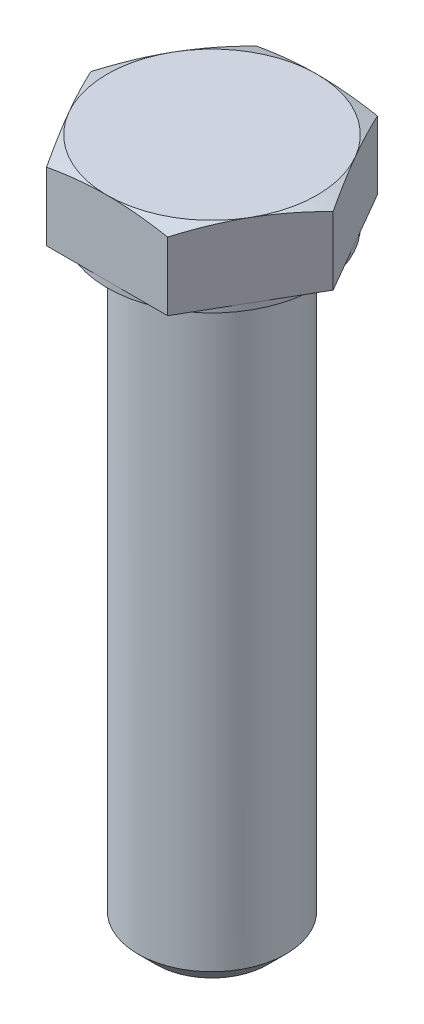
ISO-10303-21;
HEADER;
FILE_DESCRIPTION(('STEP AP214'),'2;1');
FILE_NAME('part.step','',(''),(''),'','','');
FILE_SCHEMA(('AUTOMOTIVE_DESIGN { 1 0 10303 214 1 1 1 1 }'));
ENDSEC;
DATA;
#1=APPLICATION_CONTEXT('core data for automotive mechanical design processes');
#2=APPLICATION_PROTOCOL_DEFINITION('international standard','automotive_design',2000,#1);
#3=PRODUCT_CONTEXT('',#1,'mechanical');
#4=PRODUCT('Part','Part','',(#3));
#5=PRODUCT_RELATED_PRODUCT_CATEGORY('part','',(#4));
#6=PRODUCT_DEFINITION_FORMATION('','',#4);
#7=PRODUCT_DEFINITION_CONTEXT('part definition',#1,'design');
#8=PRODUCT_DEFINITION('design','',#6,#7);
#9=PRODUCT_DEFINITION_SHAPE('','',#8);
#10=(LENGTH_UNIT() NAMED_UNIT(*) SI_UNIT(.MILLI.,.METRE.));
#11=(NAMED_UNIT(*) PLANE_ANGLE_UNIT() SI_UNIT($,.RADIAN.));
#12=(NAMED_UNIT(*) SI_UNIT($,.STERADIAN.) SOLID_ANGLE_UNIT());
#13=UNCERTAINTY_MEASURE_WITH_UNIT(LENGTH_MEASURE(1.E-05),#10,'distance_accuracy_value','');
#14=(GEOMETRIC_REPRESENTATION_CONTEXT(3) GLOBAL_UNCERTAINTY_ASSIGNED_CONTEXT((#13)) GLOBAL_UNIT_ASSIGNED_CONTEXT((#10,
#11,#12)) REPRESENTATION_CONTEXT('',''));
#15=CARTESIAN_POINT('',(0.,0.,0.));
#16=DIRECTION('',(0.,0.,1.));
#17=DIRECTION('',(1.,0.,0.));
#18=AXIS2_PLACEMENT_3D('',#15,#16,#17);
#19=CARTESIAN_POINT('',(0.,100.,0.));
#20=DIRECTION('',(0.,1.,0.));
#21=DIRECTION('',(0.,0.,1.));
#22=AXIS2_PLACEMENT_3D('',#19,#20,#21);
#23=PLANE('',#22);
#24=CARTESIAN_POINT('',(0.,100.,0.));
#25=DIRECTION('',(0.,1.,0.));
#26=DIRECTION('',(0.,0.,1.));
#27=AXIS2_PLACEMENT_3D('',#24,#25,#26);
#28=CIRCLE('',#27,17.);
#29=CARTESIAN_POINT('',(-14.7224318643355,100.,8.50000000000001));
#30=VERTEX_POINT('',#29);
#31=CARTESIAN_POINT('',(-14.7224318643355,100.,-8.49999999999999));
#32=VERTEX_POINT('',#31);
#33=EDGE_CURVE('E276',#30,#32,#28,.F.);
#34=ORIENTED_EDGE('',*,*,#33,.F.);
#35=DIRECTION('',(0.5,0.,0.866025403784438));
#36=VECTOR('',#35,1.);
#37=CARTESIAN_POINT('',(-19.6299091524473,100.,0.));
#38=LINE('',#37,#36);
#39=CARTESIAN_POINT('',(-19.6299091524473,100.,0.));
#40=VERTEX_POINT('',#39);
#41=EDGE_CURVE('E301',#40,#30,#38,.T.);
#42=ORIENTED_EDGE('',*,*,#41,.F.);
#43=DIRECTION('',(-0.5,0.,0.866025403784439));
#44=VECTOR('',#43,1.);
#45=CARTESIAN_POINT('',(-9.81495457622364,100.,-17.));
#46=LINE('',#45,#44);
#47=EDGE_CURVE('E296',#32,#40,#46,.T.);
#48=ORIENTED_EDGE('',*,*,#47,.F.);
#49=EDGE_LOOP('',(#34,#42,#48));
#50=FACE_BOUND('',#49,.T.);
#51=ADVANCED_FACE('F33',(#50),#23,.F.);
#52=CARTESIAN_POINT('',(0.,100.,-17.));
#53=VERTEX_POINT('',#52);
#54=EDGE_CURVE('E324',#32,#53,#28,.F.);
#55=ORIENTED_EDGE('',*,*,#54,.F.);
#56=CARTESIAN_POINT('',(-9.81495457622364,100.,-17.));
#57=VERTEX_POINT('',#56);
#58=EDGE_CURVE('E297',#57,#32,#46,.T.);
#59=ORIENTED_EDGE('',*,*,#58,.F.);
#60=DIRECTION('',(-1.,0.,0.));
#61=VECTOR('',#60,1.);
#62=CARTESIAN_POINT('',(9.81495457622364,100.,-17.));
#63=LINE('',#62,#61);
#64=EDGE_CURVE('E292',#53,#57,#63,.T.);
#65=ORIENTED_EDGE('',*,*,#64,.F.);
#66=EDGE_LOOP('',(#55,#59,#65));
#67=FACE_BOUND('',#66,.T.);
#68=ADVANCED_FACE('F249',(#67),#23,.F.);
#69=CARTESIAN_POINT('',(14.7224318643355,100.,-8.5));
#70=VERTEX_POINT('',#69);
#71=EDGE_CURVE('E326',#53,#70,#28,.F.);
#72=ORIENTED_EDGE('',*,*,#71,.F.);
#73=CARTESIAN_POINT('',(9.81495457622364,100.,-17.));
#74=VERTEX_POINT('',#73);
#75=EDGE_CURVE('E293',#74,#53,#63,.T.);
#76=ORIENTED_EDGE('',*,*,#75,.F.);
#77=DIRECTION('',(-0.5,0.,-0.866025403784439));
#78=VECTOR('',#77,1.);
#79=CARTESIAN_POINT('',(19.6299091524473,100.,0.));
#80=LINE('',#79,#78);
#81=EDGE_CURVE('E289',#70,#74,#80,.T.);
#82=ORIENTED_EDGE('',*,*,#81,.F.);
#83=EDGE_LOOP('',(#72,#76,#82));
#84=FACE_BOUND('',#83,.T.);
#85=ADVANCED_FACE('F254',(#84),#23,.F.);
#86=CARTESIAN_POINT('',(16.318367477945,100.,-4.76559365187041));
#87=VERTEX_POINT('',#86);
#88=EDGE_CURVE('E328',#70,#87,#28,.F.);
#89=ORIENTED_EDGE('',*,*,#88,.F.);
#90=CARTESIAN_POINT('',(19.6299091524473,100.,0.));
#91=VERTEX_POINT('',#90);
#92=EDGE_CURVE('E280',#91,#70,#80,.T.);
#93=ORIENTED_EDGE('',*,*,#92,.F.);
#94=DIRECTION('',(0.5,0.,-0.866025403784439));
#95=VECTOR('',#94,1.);
#96=CARTESIAN_POINT('',(9.81495457622364,100.,17.));
#97=LINE('',#96,#95);
#98=CARTESIAN_POINT('',(14.7224318643355,100.,8.49999999999999));
#99=VERTEX_POINT('',#98);
#100=EDGE_CURVE('E278',#99,#91,#97,.T.);
#101=ORIENTED_EDGE('',*,*,#100,.F.);
#102=CARTESIAN_POINT('',(0.,100.,0.));
#103=DIRECTION('',(0.,-1.,0.));
#104=DIRECTION('',(0.,0.,-1.));
#105=AXIS2_PLACEMENT_3D('',#102,#103,#104);
#106=CIRCLE('',#105,17.);
#107=CARTESIAN_POINT('',(16.5149176101254,100.,-4.03205857233886));
#108=VERTEX_POINT('',#107);
#109=EDGE_CURVE('E53',#108,#99,#106,.T.);
#110=ORIENTED_EDGE('',*,*,#109,.F.);
#111=CARTESIAN_POINT('',(17.,100.,-4.55513627132908));
#112=DIRECTION('',(0.,-1.,0.));
#113=DIRECTION('',(0.,0.,-1.));
#114=AXIS2_PLACEMENT_3D('',#111,#112,#113);
#115=CIRCLE('',#114,0.713382929531819);
#116=EDGE_CURVE('E48',#108,#87,#115,.T.);
#117=ORIENTED_EDGE('',*,*,#116,.T.);
#118=EDGE_LOOP('',(#89,#93,#101,#110,#117));
#119=FACE_BOUND('',#118,.T.);
#120=ADVANCED_FACE('F262',(#119),#23,.F.);
#121=CARTESIAN_POINT('',(0.,100.,17.));
#122=VERTEX_POINT('',#121);
#123=EDGE_CURVE('E273',#122,#30,#28,.F.);
#124=ORIENTED_EDGE('',*,*,#123,.F.);
#125=DIRECTION('',(1.,0.,0.));
#126=VECTOR('',#125,1.);
#127=CARTESIAN_POINT('',(-9.81495457622364,100.,17.));
#128=LINE('',#127,#126);
#129=CARTESIAN_POINT('',(-9.81495457622364,100.,17.));
#130=VERTEX_POINT('',#129);
#131=EDGE_CURVE('E283',#130,#122,#128,.T.);
#132=ORIENTED_EDGE('',*,*,#131,.F.);
#133=EDGE_CURVE('E300',#30,#130,#38,.T.);
#134=ORIENTED_EDGE('',*,*,#133,.F.);
#135=EDGE_LOOP('',(#124,#132,#134));
#136=FACE_BOUND('',#135,.T.);
#137=ADVANCED_FACE('F257',(#136),#23,.F.);
#138=EDGE_CURVE('E267',#99,#122,#28,.F.);
#139=ORIENTED_EDGE('',*,*,#138,.F.);
#140=CARTESIAN_POINT('',(9.81495457622364,100.,17.));
#141=VERTEX_POINT('',#140);
#142=EDGE_CURVE('E269',#141,#99,#97,.T.);
#143=ORIENTED_EDGE('',*,*,#142,.F.);
#144=EDGE_CURVE('E270',#122,#141,#128,.T.);
#145=ORIENTED_EDGE('',*,*,#144,.F.);
#146=EDGE_LOOP('',(#139,#143,#145));
#147=FACE_BOUND('',#146,.T.);
#148=ADVANCED_FACE('F234',(#147),#23,.F.);
#149=CARTESIAN_POINT('',(-9.81495457622364,112.,17.));
#150=DIRECTION('',(0.,0.,-1.));
#151=DIRECTION('',(-1.,0.,0.));
#152=AXIS2_PLACEMENT_3D('',#149,#150,#151);
#153=PLANE('',#152);
#154=CARTESIAN_POINT('',(-26.4697197491715,106.737485221416,17.));
#155=CARTESIAN_POINT('',(-26.0821170199372,106.856185965166,17.));
#156=CARTESIAN_POINT('',(-25.6943026479638,106.974195246723,17.));
#157=CARTESIAN_POINT('',(-24.9182071227426,107.208676142604,17.));
#158=CARTESIAN_POINT('',(-24.5299259669509,107.325147748508,17.));
#159=CARTESIAN_POINT('',(-23.364269306612,107.672038108694,17.));
#160=CARTESIAN_POINT('',(-22.5861346103809,107.899915821065,17.));
#161=CARTESIAN_POINT('',(-21.0261720720469,108.347704804024,17.));
#162=CARTESIAN_POINT('',(-20.2443402430302,108.567602218294,17.));
#163=CARTESIAN_POINT('',(-18.6778314073542,108.997005965805,17.));
#164=CARTESIAN_POINT('',(-17.8931544492824,109.206512475609,17.));
#165=CARTESIAN_POINT('',(-16.3312570237883,109.60974905728,17.));
#166=CARTESIAN_POINT('',(-15.5540825888639,109.803656591454,17.));
#167=CARTESIAN_POINT('',(-13.9959252131608,110.175682389467,17.));
#168=CARTESIAN_POINT('',(-13.2149422105743,110.353800396159,17.));
#169=CARTESIAN_POINT('',(-11.6488680529933,110.690265902283,17.));
#170=CARTESIAN_POINT('',(-10.8637778100454,110.848617611749,17.));
#171=CARTESIAN_POINT('',(-9.28902353512944,111.140862263872,17.));
#172=CARTESIAN_POINT('',(-8.49935964385694,111.274755954831,17.));
#173=CARTESIAN_POINT('',(-7.00295625265717,111.499645775448,17.));
#174=CARTESIAN_POINT('',(-6.29668765800536,111.593746054297,17.));
#175=CARTESIAN_POINT('',(-4.88102243226316,111.754660262071,17.));
#176=CARTESIAN_POINT('',(-4.17162589209052,111.821474978868,17.));
#177=CARTESIAN_POINT('',(-2.75119540140838,111.924608855883,17.));
#178=CARTESIAN_POINT('',(-2.04016337883112,111.960954140636,17.));
#179=CARTESIAN_POINT('',(-0.617173057572768,112.001307038098,17.));
#180=CARTESIAN_POINT('',(0.094785231994638,112.005314966608,17.));
#181=CARTESIAN_POINT('',(1.52268753934835,111.980689746647,17.));
#182=CARTESIAN_POINT('',(2.23862789900213,111.95184749936,17.));
#183=CARTESIAN_POINT('',(3.6685339302256,111.862767829682,17.));
#184=CARTESIAN_POINT('',(4.382499548981,111.802529575616,17.));
#185=CARTESIAN_POINT('',(5.80812992154151,111.653571269492,17.));
#186=CARTESIAN_POINT('',(6.51979173173999,111.564823339623,17.));
#187=CARTESIAN_POINT('',(7.58457715848327,111.413158320706,17.));
#188=CARTESIAN_POINT('',(7.93905709602813,111.359512316792,17.));
#189=CARTESIAN_POINT('',(8.64710961709139,111.246520044635,17.));
#190=CARTESIAN_POINT('',(9.00068219614608,111.187173748403,17.));
#191=CARTESIAN_POINT('',(10.2902101773909,110.960923510139,17.));
#192=CARTESIAN_POINT('',(11.2234234988153,110.778281768109,17.));
#193=CARTESIAN_POINT('',(13.0838397098375,110.384478731822,17.));
#194=CARTESIAN_POINT('',(14.0110416712263,110.173313138192,17.));
#195=CARTESIAN_POINT('',(15.8606663078421,109.728979788751,17.));
#196=CARTESIAN_POINT('',(16.7830860491139,109.495799902339,17.));
#197=CARTESIAN_POINT('',(18.62343678507,109.012653849316,17.));
#198=CARTESIAN_POINT('',(19.5413680084769,108.762688547812,17.));
#199=CARTESIAN_POINT('',(21.3755897087675,108.24922858335,17.));
#200=CARTESIAN_POINT('',(22.2918721978316,107.985705507318,17.));
#201=CARTESIAN_POINT('',(24.1214550446737,107.448505793717,17.));
#202=CARTESIAN_POINT('',(25.0347553749196,107.174829062694,17.));
#203=CARTESIAN_POINT('',(26.858622260083,106.619559845579,17.));
#204=CARTESIAN_POINT('',(27.7691895944999,106.337969913829,17.));
#205=CARTESIAN_POINT('',(29.5883182591495,105.768407218869,17.));
#206=CARTESIAN_POINT('',(30.4968795974246,105.480434481301,17.));
#207=CARTESIAN_POINT('',(32.2962419324909,104.904489170698,17.));
#208=CARTESIAN_POINT('',(33.187071992894,104.616607273955,17.));
#209=CARTESIAN_POINT('',(34.9674033792845,104.036766311558,17.));
#210=CARTESIAN_POINT('',(35.8569047046558,103.744807244016,17.));
#211=CARTESIAN_POINT('',(37.6348725201154,103.157487172826,17.));
#212=CARTESIAN_POINT('',(38.5233389085644,102.862125861731,17.));
#213=CARTESIAN_POINT('',(40.2993288321072,102.268581605424,17.));
#214=CARTESIAN_POINT('',(41.1868523665112,101.97039865815,17.));
#215=CARTESIAN_POINT('',(42.9563136616433,101.373268065894,17.));
#216=CARTESIAN_POINT('',(43.8382557404692,101.07433321027,17.));
#217=CARTESIAN_POINT('',(45.6014587294762,100.474460922015,17.));
#218=CARTESIAN_POINT('',(46.4827196393852,100.173523488586,17.));
#219=CARTESIAN_POINT('',(48.2445490837946,99.5699706185378,17.));
#220=CARTESIAN_POINT('',(49.1251176882879,99.2673553861518,17.));
#221=CARTESIAN_POINT('',(50.8857410451855,98.6606384471791,17.));
#222=CARTESIAN_POINT('',(51.7657957984632,98.3565367431273,17.));
#223=CARTESIAN_POINT('',(52.6456318283597,98.0518048287649,17.));
#224=B_SPLINE_CURVE_WITH_KNOTS('',3,(#154,#155,#156,#157,#158,#159,#160,#161,#162,#163,#164,
#165,#166,#167,#168,#169,#170,#171,#172,#173,#174,#175,#176,#177,#178,#179,#180,#181,#182,#183,
#184,#185,#186,#187,#188,#189,#190,#191,#192,#193,#194,#195,#196,#197,#198,#199,#200,#201,#202,
#203,#204,#205,#206,#207,#208,#209,#210,#211,#212,#213,#214,#215,#216,#217,#218,#219,#220,#221,
#222,#223),.UNSPECIFIED.,.F.,.F.,(4,2,2,2,2,2,2,2,2,2,2,2,2,2,2,2,2,2,2,2,2,2,2,2,2,2,2,2,2,2,2,
2,2,2,4),(0.,1.21611213620866,2.43223093057107,4.86463798569911,7.30108397567136,
9.73748855153796,12.1403570090625,14.5432645924021,16.9456595028563,19.3479808987908,
21.4850542712776,23.6220659311678,25.7572434347567,27.892400086524,30.0412238150452,
32.1901044684959,34.3410928054971,35.4166032790176,36.4921190333691,39.344207178979,
42.1967256977463,45.0508253259633,47.9047779689102,50.7649767820742,53.6252019272916,
56.4845141774584,59.3438149430241,62.1523771622768,64.960940683054,67.769760025284,
70.5785814210216,73.372259884443,76.1659394635795,78.9592861326524,81.7526280396854),.UNSPECIFIED.);
#225=CARTESIAN_POINT('',(-9.81495457622364,111.042791349685,17.));
#226=VERTEX_POINT('',#225);
#227=CARTESIAN_POINT('',(0.,112.,17.));
#228=VERTEX_POINT('',#227);
#229=EDGE_CURVE('E367',#226,#228,#224,.T.);
#230=ORIENTED_EDGE('',*,*,#229,.F.);
#231=DIRECTION('',(0.,-1.,0.));
#232=VECTOR('',#231,1.);
#233=CARTESIAN_POINT('',(-9.81495457622364,112.,17.));
#234=LINE('',#233,#232);
#235=EDGE_CURVE('E304',#226,#130,#234,.T.);
#236=ORIENTED_EDGE('',*,*,#235,.T.);
#237=ORIENTED_EDGE('',*,*,#131,.T.);
#238=ORIENTED_EDGE('',*,*,#144,.T.);
#239=DIRECTION('',(0.,-1.,0.));
#240=VECTOR('',#239,1.);
#241=CARTESIAN_POINT('',(9.81495457622364,112.,17.));
#242=LINE('',#241,#240);
#243=CARTESIAN_POINT('',(9.81495457622364,111.042791349685,17.));
#244=VERTEX_POINT('',#243);
#245=EDGE_CURVE('E288',#244,#141,#242,.T.);
#246=ORIENTED_EDGE('',*,*,#245,.F.);
#247=EDGE_CURVE('E217',#228,#244,#224,.T.);
#248=ORIENTED_EDGE('',*,*,#247,.F.);
#249=EDGE_LOOP('',(#230,#236,#237,#238,#246,#248));
#250=FACE_BOUND('',#249,.T.);
#251=ADVANCED_FACE('F228',(#250),#153,.F.);
#252=CARTESIAN_POINT('',(9.81495457622364,112.,17.));
#253=DIRECTION('',(-0.866025403784439,0.,-0.5));
#254=DIRECTION('',(-0.5,0.,0.866025403784439));
#255=AXIS2_PLACEMENT_3D('',#252,#253,#254);
#256=PLANE('',#255);
#257=CARTESIAN_POINT('',(9.8148391061698,111.042749321652,17.0002));
#258=CARTESIAN_POINT('',(10.0181017076924,111.116725694929,16.6481388468842));
#259=CARTESIAN_POINT('',(10.2216630354324,111.187375159609,16.2955602847824));
#260=CARTESIAN_POINT('',(10.6294108800524,111.321288394131,15.5893203012238));
#261=CARTESIAN_POINT('',(10.8335974545269,111.384551461208,15.2356587800106));
#262=CARTESIAN_POINT('',(11.447361293929,111.562224618796,14.1725886263175));
#263=CARTESIAN_POINT('',(11.8578616813392,111.664414340559,13.4615810987964));
#264=CARTESIAN_POINT('',(12.4730971202796,111.788607667844,12.3959620599347));
#265=CARTESIAN_POINT('',(12.6771223369906,111.82505165791,12.0425800185659));
#266=CARTESIAN_POINT('',(13.0855537091748,111.887987670669,11.3351561305379));
#267=CARTESIAN_POINT('',(13.2899598487629,111.914480099418,10.9811143113923));
#268=CARTESIAN_POINT('',(13.6989734026656,111.95705022654,10.2726820550485));
#269=CARTESIAN_POINT('',(13.903580724092,111.973131488042,9.91829177873734));
#270=CARTESIAN_POINT('',(14.3129359854144,111.994606358301,9.20926766778139));
#271=CARTESIAN_POINT('',(14.5176839248749,112.,8.85463383389069));
#272=CARTESIAN_POINT('',(14.927179803796,112.,8.1453661661093));
#273=CARTESIAN_POINT('',(15.1319277432565,111.994606358301,7.79073233221861));
#274=CARTESIAN_POINT('',(15.5412830045789,111.973131488042,7.08170822126266));
#275=CARTESIAN_POINT('',(15.7458903260053,111.95705022654,6.7273179449515));
#276=CARTESIAN_POINT('',(16.154903879908,111.914480099418,6.01888568860768));
#277=CARTESIAN_POINT('',(16.3593100194961,111.887987670669,5.66484386946207));
#278=CARTESIAN_POINT('',(16.7677413916803,111.82505165791,4.95741998143408));
#279=CARTESIAN_POINT('',(16.9717666083913,111.788607667844,4.6040379400653));
#280=CARTESIAN_POINT('',(17.5870020473317,111.664414340559,3.53841890120358));
#281=CARTESIAN_POINT('',(17.9975024347419,111.562224618796,2.82741137368246));
#282=CARTESIAN_POINT('',(18.6112662741441,111.384551461208,1.76434121998938));
#283=CARTESIAN_POINT('',(18.8154528486185,111.321288394131,1.41067969877616));
#284=CARTESIAN_POINT('',(19.2232006932385,111.187375159609,0.704439715217627));
#285=CARTESIAN_POINT('',(19.4267620209785,111.116725694929,0.351861153115775));
#286=CARTESIAN_POINT('',(19.6300246225011,111.042749321652,-0.000200000000008678));
#287=B_SPLINE_CURVE_WITH_KNOTS('',3,(#257,#258,#259,#260,#261,#262,#263,#264,#265,#266,#267,
#268,#269,#270,#271,#272,#273,#274,#275,#276,#277,#278,#279,#280,#281,#282,#283,#284,#285,#286),
.UNSPECIFIED.,.F.,.F.,(4,2,2,2,2,2,2,2,2,2,2,2,2,2,4),(0.,1.23956682356502,2.47925148764668,
4.96033455795438,6.18926159198408,7.41813847635417,8.64659456589167,9.87504686886565,
11.1034991718396,12.3319552613771,13.5608321457472,14.7897591797769,17.2708422500846,
18.5105269141663,19.7500937377313),.UNSPECIFIED.);
#288=CARTESIAN_POINT('',(14.7224318643355,112.,8.5));
#289=VERTEX_POINT('',#288);
#290=EDGE_CURVE('E215',#244,#289,#287,.T.);
#291=ORIENTED_EDGE('',*,*,#290,.F.);
#292=ORIENTED_EDGE('',*,*,#245,.T.);
#293=ORIENTED_EDGE('',*,*,#142,.T.);
#294=ORIENTED_EDGE('',*,*,#100,.T.);
#295=DIRECTION('',(0.,-1.,0.));
#296=VECTOR('',#295,1.);
#297=CARTESIAN_POINT('',(19.6299091524473,112.,0.));
#298=LINE('',#297,#296);
#299=CARTESIAN_POINT('',(19.6299091524473,111.042791349685,0.));
#300=VERTEX_POINT('',#299);
#301=EDGE_CURVE('E316',#300,#91,#298,.T.);
#302=ORIENTED_EDGE('',*,*,#301,.F.);
#303=EDGE_CURVE('E209',#289,#300,#287,.T.);
#304=ORIENTED_EDGE('',*,*,#303,.F.);
#305=EDGE_LOOP('',(#291,#292,#293,#294,#302,#304));
#306=FACE_BOUND('',#305,.T.);
#307=ADVANCED_FACE('F224',(#306),#256,.F.);
#308=CARTESIAN_POINT('',(19.6299091524473,112.,0.));
#309=DIRECTION('',(-0.866025403784438,0.,0.5));
#310=DIRECTION('',(0.5,0.,0.866025403784439));
#311=AXIS2_PLACEMENT_3D('',#308,#309,#310);
#312=PLANE('',#311);
#313=CARTESIAN_POINT('',(19.6300246225011,111.042749321652,0.000199999999990214));
#314=CARTESIAN_POINT('',(19.4267620209785,111.116725694929,-0.351861153115792));
#315=CARTESIAN_POINT('',(19.2232006932385,111.187375159609,-0.704439715217645));
#316=CARTESIAN_POINT('',(18.8154528486185,111.321288394131,-1.41067969877618));
#317=CARTESIAN_POINT('',(18.6112662741441,111.384551461208,-1.7643412199894));
#318=CARTESIAN_POINT('',(17.9975024347419,111.562224618796,-2.82741137368248));
#319=CARTESIAN_POINT('',(17.5870020473317,111.664414340559,-3.5384189012036));
#320=CARTESIAN_POINT('',(16.9717666083913,111.788607667844,-4.60403794006531));
#321=CARTESIAN_POINT('',(16.7677413916803,111.82505165791,-4.9574199814341));
#322=CARTESIAN_POINT('',(16.3593100194961,111.887987670669,-5.66484386946208));
#323=CARTESIAN_POINT('',(16.154903879908,111.914480099418,-6.01888568860769));
#324=CARTESIAN_POINT('',(15.7458903260053,111.95705022654,-6.72731794495151));
#325=CARTESIAN_POINT('',(15.5412830045789,111.973131488042,-7.08170822126267));
#326=CARTESIAN_POINT('',(15.1319277432565,111.994606358301,-7.79073233221862));
#327=CARTESIAN_POINT('',(14.927179803796,112.,-8.14536616610931));
#328=CARTESIAN_POINT('',(14.5176839248749,112.,-8.85463383389071));
#329=CARTESIAN_POINT('',(14.3129359854144,111.994606358301,-9.2092676677814));
#330=CARTESIAN_POINT('',(13.903580724092,111.973131488042,-9.91829177873735));
#331=CARTESIAN_POINT('',(13.6989734026656,111.95705022654,-10.2726820550485));
#332=CARTESIAN_POINT('',(13.2899598487629,111.914480099418,-10.9811143113923));
#333=CARTESIAN_POINT('',(13.0855537091748,111.887987670669,-11.3351561305379));
#334=CARTESIAN_POINT('',(12.6771223369906,111.82505165791,-12.0425800185659));
#335=CARTESIAN_POINT('',(12.4730971202796,111.788607667844,-12.3959620599347));
#336=CARTESIAN_POINT('',(11.8578616813392,111.664414340559,-13.4615810987964));
#337=CARTESIAN_POINT('',(11.447361293929,111.562224618796,-14.1725886263175));
#338=CARTESIAN_POINT('',(10.8335974545269,111.384551461208,-15.2356587800106));
#339=CARTESIAN_POINT('',(10.6294108800524,111.321288394131,-15.5893203012238));
#340=CARTESIAN_POINT('',(10.2216630354324,111.187375159609,-16.2955602847824));
#341=CARTESIAN_POINT('',(10.0181017076924,111.116725694929,-16.6481388468842));
#342=CARTESIAN_POINT('',(9.8148391061698,111.042749321652,-17.0002));
#343=B_SPLINE_CURVE_WITH_KNOTS('',3,(#313,#314,#315,#316,#317,#318,#319,#320,#321,#322,#323,
#324,#325,#326,#327,#328,#329,#330,#331,#332,#333,#334,#335,#336,#337,#338,#339,#340,#341,#342),
.UNSPECIFIED.,.F.,.F.,(4,2,2,2,2,2,2,2,2,2,2,2,2,2,4),(0.,1.23956682356502,2.47925148764668,
4.96033455795438,6.18926159198408,7.41813847635416,8.64659456589166,9.87504686886564,
11.1034991718396,12.3319552613771,13.5608321457472,14.7897591797769,17.2708422500846,
18.5105269141663,19.7500937377313),.UNSPECIFIED.);
#344=CARTESIAN_POINT('',(14.7224318643355,112.,-8.50000000000001));
#345=VERTEX_POINT('',#344);
#346=EDGE_CURVE('E216',#300,#345,#343,.T.);
#347=ORIENTED_EDGE('',*,*,#346,.F.);
#348=ORIENTED_EDGE('',*,*,#301,.T.);
#349=ORIENTED_EDGE('',*,*,#92,.T.);
#350=ORIENTED_EDGE('',*,*,#81,.T.);
#351=DIRECTION('',(0.,-1.,0.));
#352=VECTOR('',#351,1.);
#353=CARTESIAN_POINT('',(9.81495457622364,112.,-17.));
#354=LINE('',#353,#352);
#355=CARTESIAN_POINT('',(9.81495457622364,111.042791349685,-17.));
#356=VERTEX_POINT('',#355);
#357=EDGE_CURVE('E313',#356,#74,#354,.T.);
#358=ORIENTED_EDGE('',*,*,#357,.F.);
#359=EDGE_CURVE('E202',#345,#356,#343,.T.);
#360=ORIENTED_EDGE('',*,*,#359,.F.);
#361=EDGE_LOOP('',(#347,#348,#349,#350,#358,#360));
#362=FACE_BOUND('',#361,.T.);
#363=ADVANCED_FACE('F227',(#362),#312,.F.);
#364=CARTESIAN_POINT('',(9.81495457622364,112.,-17.));
#365=DIRECTION('',(0.,0.,1.));
#366=DIRECTION('',(1.,0.,0.));
#367=AXIS2_PLACEMENT_3D('',#364,#365,#366);
#368=PLANE('',#367);
#369=CARTESIAN_POINT('',(-26.4697197491715,106.737485221416,-17.));
#370=CARTESIAN_POINT('',(-26.0821170199372,106.856185965166,-17.));
#371=CARTESIAN_POINT('',(-25.6943026479638,106.974195246723,-17.));
#372=CARTESIAN_POINT('',(-24.9182071227426,107.208676142604,-17.));
#373=CARTESIAN_POINT('',(-24.5299259669509,107.325147748508,-17.));
#374=CARTESIAN_POINT('',(-23.364269306612,107.672038108694,-17.));
#375=CARTESIAN_POINT('',(-22.5861346103809,107.899915821065,-17.));
#376=CARTESIAN_POINT('',(-21.0261720720469,108.347704804024,-17.));
#377=CARTESIAN_POINT('',(-20.2443402430302,108.567602218294,-17.));
#378=CARTESIAN_POINT('',(-18.6778314073542,108.997005965805,-17.));
#379=CARTESIAN_POINT('',(-17.8931544492824,109.206512475609,-17.));
#380=CARTESIAN_POINT('',(-16.3312570237883,109.60974905728,-17.));
#381=CARTESIAN_POINT('',(-15.5540825888639,109.803656591454,-17.));
#382=CARTESIAN_POINT('',(-13.9959252131608,110.175682389467,-17.));
#383=CARTESIAN_POINT('',(-13.2149422105743,110.353800396159,-17.));
#384=CARTESIAN_POINT('',(-11.6488680529933,110.690265902283,-17.));
#385=CARTESIAN_POINT('',(-10.8637778100454,110.848617611749,-17.));
#386=CARTESIAN_POINT('',(-9.28902353512945,111.140862263872,-17.));
#387=CARTESIAN_POINT('',(-8.49935964385695,111.274755954831,-17.));
#388=CARTESIAN_POINT('',(-7.00295625265718,111.499645775448,-17.));
#389=CARTESIAN_POINT('',(-6.29668765800537,111.593746054297,-17.));
#390=CARTESIAN_POINT('',(-4.88102243226317,111.754660262071,-17.));
#391=CARTESIAN_POINT('',(-4.17162589209052,111.821474978868,-17.));
#392=CARTESIAN_POINT('',(-2.75119540140839,111.924608855883,-17.));
#393=CARTESIAN_POINT('',(-2.04016337883113,111.960954140636,-17.));
#394=CARTESIAN_POINT('',(-0.617173057572775,112.001307038098,-17.));
#395=CARTESIAN_POINT('',(0.0947852319946312,112.005314966608,-17.));
#396=CARTESIAN_POINT('',(1.52268753934834,111.980689746647,-17.));
#397=CARTESIAN_POINT('',(2.23862789900212,111.95184749936,-17.));
#398=CARTESIAN_POINT('',(3.66853393022559,111.862767829682,-17.));
#399=CARTESIAN_POINT('',(4.38249954898099,111.802529575616,-17.));
#400=CARTESIAN_POINT('',(5.80812992154151,111.653571269492,-17.));
#401=CARTESIAN_POINT('',(6.51979173173999,111.564823339623,-17.));
#402=CARTESIAN_POINT('',(7.58457715848327,111.413158320706,-17.));
#403=CARTESIAN_POINT('',(7.93905709602813,111.359512316792,-17.));
#404=CARTESIAN_POINT('',(8.64710961709139,111.246520044635,-17.));
#405=CARTESIAN_POINT('',(9.00068219614608,111.187173748403,-17.));
#406=CARTESIAN_POINT('',(10.2902101773909,110.960923510139,-17.));
#407=CARTESIAN_POINT('',(11.2234234988153,110.778281768109,-17.));
#408=CARTESIAN_POINT('',(13.0838397098375,110.384478731822,-17.));
#409=CARTESIAN_POINT('',(14.0110416712263,110.173313138192,-17.));
#410=CARTESIAN_POINT('',(15.8606663078421,109.728979788751,-17.));
#411=CARTESIAN_POINT('',(16.7830860491139,109.495799902339,-17.));
#412=CARTESIAN_POINT('',(18.62343678507,109.012653849316,-17.));
#413=CARTESIAN_POINT('',(19.5413680084769,108.762688547812,-17.));
#414=CARTESIAN_POINT('',(21.3755897087675,108.24922858335,-17.));
#415=CARTESIAN_POINT('',(22.2918721978316,107.985705507318,-17.));
#416=CARTESIAN_POINT('',(24.1214550446737,107.448505793717,-17.));
#417=CARTESIAN_POINT('',(25.0347553749196,107.174829062694,-17.));
#418=CARTESIAN_POINT('',(26.858622260083,106.619559845579,-17.));
#419=CARTESIAN_POINT('',(27.7691895944999,106.337969913829,-17.));
#420=CARTESIAN_POINT('',(29.5883182591495,105.768407218869,-17.));
#421=CARTESIAN_POINT('',(30.4968795974246,105.480434481301,-17.));
#422=CARTESIAN_POINT('',(32.2962419324909,104.904489170698,-17.));
#423=CARTESIAN_POINT('',(33.187071992894,104.616607273955,-17.));
#424=CARTESIAN_POINT('',(34.9674033792845,104.036766311558,-17.));
#425=CARTESIAN_POINT('',(35.8569047046558,103.744807244016,-17.));
#426=CARTESIAN_POINT('',(37.6348725201154,103.157487172826,-17.));
#427=CARTESIAN_POINT('',(38.5233389085644,102.862125861731,-17.));
#428=CARTESIAN_POINT('',(40.2993288321072,102.268581605424,-17.));
#429=CARTESIAN_POINT('',(41.1868523665112,101.97039865815,-17.));
#430=CARTESIAN_POINT('',(42.9563136616433,101.373268065894,-17.));
#431=CARTESIAN_POINT('',(43.8382557404692,101.07433321027,-17.));
#432=CARTESIAN_POINT('',(45.6014587294763,100.474460922015,-17.));
#433=CARTESIAN_POINT('',(46.4827196393853,100.173523488586,-17.));
#434=CARTESIAN_POINT('',(48.2445490837946,99.5699706185378,-17.));
#435=CARTESIAN_POINT('',(49.1251176882879,99.2673553861518,-17.));
#436=CARTESIAN_POINT('',(50.8857410451855,98.6606384471791,-17.));
#437=CARTESIAN_POINT('',(51.7657957984632,98.3565367431273,-17.));
#438=CARTESIAN_POINT('',(52.6456318283597,98.0518048287649,-17.));
#439=B_SPLINE_CURVE_WITH_KNOTS('',3,(#369,#370,#371,#372,#373,#374,#375,#376,#377,#378,#379,
#380,#381,#382,#383,#384,#385,#386,#387,#388,#389,#390,#391,#392,#393,#394,#395,#396,#397,#398,
#399,#400,#401,#402,#403,#404,#405,#406,#407,#408,#409,#410,#411,#412,#413,#414,#415,#416,#417,
#418,#419,#420,#421,#422,#423,#424,#425,#426,#427,#428,#429,#430,#431,#432,#433,#434,#435,#436,
#437,#438),.UNSPECIFIED.,.F.,.F.,(4,2,2,2,2,2,2,2,2,2,2,2,2,2,2,2,2,2,2,2,2,2,2,2,2,2,2,2,2,2,2,
2,2,2,4),(0.,1.21611213620868,2.43223093057108,4.86463798569912,7.30108397567136,
9.73748855153796,12.1403570090625,14.5432645924021,16.9456595028563,19.3479808987908,
21.4850542712776,23.6220659311679,25.7572434347567,27.892400086524,30.0412238150452,
32.1901044684959,34.3410928054972,35.4166032790176,36.4921190333691,39.344207178979,
42.1967256977463,45.0508253259634,47.9047779689102,50.7649767820743,53.6252019272917,
56.4845141774585,59.3438149430242,62.1523771622768,64.9609406830541,67.7697600252841,
70.5785814210217,73.3722598844431,76.1659394635796,78.9592861326524,81.7526280396855),.UNSPECIFIED.);
#440=CARTESIAN_POINT('',(0.,112.,-17.));
#441=VERTEX_POINT('',#440);
#442=EDGE_CURVE('E376',#356,#441,#439,.F.);
#443=ORIENTED_EDGE('',*,*,#442,.F.);
#444=ORIENTED_EDGE('',*,*,#357,.T.);
#445=ORIENTED_EDGE('',*,*,#75,.T.);
#446=ORIENTED_EDGE('',*,*,#64,.T.);
#447=DIRECTION('',(0.,-1.,0.));
#448=VECTOR('',#447,1.);
#449=CARTESIAN_POINT('',(-9.81495457622364,112.,-17.));
#450=LINE('',#449,#448);
#451=CARTESIAN_POINT('',(-9.81495457622364,111.042791349685,-17.));
#452=VERTEX_POINT('',#451);
#453=EDGE_CURVE('E310',#452,#57,#450,.T.);
#454=ORIENTED_EDGE('',*,*,#453,.F.);
#455=EDGE_CURVE('E195',#441,#452,#439,.F.);
#456=ORIENTED_EDGE('',*,*,#455,.F.);
#457=EDGE_LOOP('',(#443,#444,#445,#446,#454,#456));
#458=FACE_BOUND('',#457,.T.);
#459=ADVANCED_FACE('F346',(#458),#368,.F.);
#460=CARTESIAN_POINT('',(-9.81495457622364,112.,-17.));
#461=DIRECTION('',(0.866025403784439,0.,0.5));
#462=DIRECTION('',(0.5,0.,-0.866025403784439));
#463=AXIS2_PLACEMENT_3D('',#460,#461,#462);
#464=PLANE('',#463);
#465=CARTESIAN_POINT('',(-9.8148391061698,111.042749321652,-17.0002));
#466=CARTESIAN_POINT('',(-10.0181017076924,111.116725694929,-16.6481388468842));
#467=CARTESIAN_POINT('',(-10.2216630354324,111.187375159609,-16.2955602847824));
#468=CARTESIAN_POINT('',(-10.6294108800524,111.321288394131,-15.5893203012238));
#469=CARTESIAN_POINT('',(-10.8335974545269,111.384551461208,-15.2356587800106));
#470=CARTESIAN_POINT('',(-11.447361293929,111.562224618796,-14.1725886263175));
#471=CARTESIAN_POINT('',(-11.8578616813392,111.664414340559,-13.4615810987964));
#472=CARTESIAN_POINT('',(-12.4730971202796,111.788607667844,-12.3959620599347));
#473=CARTESIAN_POINT('',(-12.6771223369906,111.82505165791,-12.0425800185659));
#474=CARTESIAN_POINT('',(-13.0855537091748,111.887987670669,-11.3351561305379));
#475=CARTESIAN_POINT('',(-13.2899598487629,111.914480099418,-10.9811143113923));
#476=CARTESIAN_POINT('',(-13.6989734026656,111.95705022654,-10.2726820550485));
#477=CARTESIAN_POINT('',(-13.903580724092,111.973131488042,-9.91829177873734));
#478=CARTESIAN_POINT('',(-14.3129359854144,111.994606358301,-9.20926766778139));
#479=CARTESIAN_POINT('',(-14.5176839248749,112.,-8.85463383389069));
#480=CARTESIAN_POINT('',(-14.927179803796,112.,-8.1453661661093));
#481=CARTESIAN_POINT('',(-15.1319277432565,111.994606358301,-7.79073233221861));
#482=CARTESIAN_POINT('',(-15.5412830045789,111.973131488042,-7.08170822126265));
#483=CARTESIAN_POINT('',(-15.7458903260053,111.95705022654,-6.7273179449515));
#484=CARTESIAN_POINT('',(-16.1549038799081,111.914480099418,-6.01888568860768));
#485=CARTESIAN_POINT('',(-16.3593100194962,111.887987670669,-5.66484386946207));
#486=CARTESIAN_POINT('',(-16.7677413916803,111.82505165791,-4.95741998143408));
#487=CARTESIAN_POINT('',(-16.9717666083913,111.788607667844,-4.6040379400653));
#488=CARTESIAN_POINT('',(-17.5870020473317,111.664414340559,-3.53841890120359));
#489=CARTESIAN_POINT('',(-17.9975024347419,111.562224618796,-2.82741137368246));
#490=CARTESIAN_POINT('',(-18.6112662741441,111.384551461208,-1.76434121998938));
#491=CARTESIAN_POINT('',(-18.8154528486185,111.321288394131,-1.41067969877616));
#492=CARTESIAN_POINT('',(-19.2232006932385,111.187375159609,-0.704439715217626));
#493=CARTESIAN_POINT('',(-19.4267620209785,111.116725694929,-0.351861153115773));
#494=CARTESIAN_POINT('',(-19.6300246225011,111.042749321652,0.00020000000000927));
#495=B_SPLINE_CURVE_WITH_KNOTS('',3,(#465,#466,#467,#468,#469,#470,#471,#472,#473,#474,#475,
#476,#477,#478,#479,#480,#481,#482,#483,#484,#485,#486,#487,#488,#489,#490,#491,#492,#493,#494),
.UNSPECIFIED.,.F.,.F.,(4,2,2,2,2,2,2,2,2,2,2,2,2,2,4),(0.,1.23956682356502,2.47925148764668,
4.96033455795439,6.18926159198408,7.41813847635417,8.64659456589167,9.87504686886565,
11.1034991718396,12.3319552613771,13.5608321457472,14.7897591797769,17.2708422500846,
18.5105269141663,19.7500937377313),.UNSPECIFIED.);
#496=CARTESIAN_POINT('',(-14.7224318643355,112.,-8.5));
#497=VERTEX_POINT('',#496);
#498=EDGE_CURVE('E373',#452,#497,#495,.T.);
#499=ORIENTED_EDGE('',*,*,#498,.F.);
#500=ORIENTED_EDGE('',*,*,#453,.T.);
#501=ORIENTED_EDGE('',*,*,#58,.T.);
#502=ORIENTED_EDGE('',*,*,#47,.T.);
#503=DIRECTION('',(0.,-1.,0.));
#504=VECTOR('',#503,1.);
#505=CARTESIAN_POINT('',(-19.6299091524473,112.,0.));
#506=LINE('',#505,#504);
#507=CARTESIAN_POINT('',(-19.6299091524473,111.042791349685,0.));
#508=VERTEX_POINT('',#507);
#509=EDGE_CURVE('E307',#508,#40,#506,.T.);
#510=ORIENTED_EDGE('',*,*,#509,.F.);
#511=EDGE_CURVE('E169',#497,#508,#495,.T.);
#512=ORIENTED_EDGE('',*,*,#511,.F.);
#513=EDGE_LOOP('',(#499,#500,#501,#502,#510,#512));
#514=FACE_BOUND('',#513,.T.);
#515=ADVANCED_FACE('F340',(#514),#464,.F.);
#516=CARTESIAN_POINT('',(-19.6299091524473,112.,0.));
#517=DIRECTION('',(0.866025403784438,0.,-0.5));
#518=DIRECTION('',(-0.5,0.,-0.866025403784439));
#519=AXIS2_PLACEMENT_3D('',#516,#517,#518);
#520=PLANE('',#519);
#521=CARTESIAN_POINT('',(-19.6300246225011,111.042749321652,-0.000199999999989443));
#522=CARTESIAN_POINT('',(-19.4267620209785,111.116725694929,0.351861153115793));
#523=CARTESIAN_POINT('',(-19.2232006932385,111.187375159609,0.704439715217645));
#524=CARTESIAN_POINT('',(-18.8154528486185,111.321288394131,1.41067969877618));
#525=CARTESIAN_POINT('',(-18.6112662741441,111.384551461208,1.7643412199894));
#526=CARTESIAN_POINT('',(-17.9975024347419,111.562224618796,2.82741137368248));
#527=CARTESIAN_POINT('',(-17.5870020473317,111.664414340559,3.5384189012036));
#528=CARTESIAN_POINT('',(-16.9717666083913,111.788607667844,4.60403794006531));
#529=CARTESIAN_POINT('',(-16.7677413916803,111.82505165791,4.9574199814341));
#530=CARTESIAN_POINT('',(-16.3593100194962,111.887987670669,5.66484386946208));
#531=CARTESIAN_POINT('',(-16.1549038799081,111.914480099418,6.01888568860769));
#532=CARTESIAN_POINT('',(-15.7458903260053,111.95705022654,6.72731794495151));
#533=CARTESIAN_POINT('',(-15.5412830045789,111.973131488042,7.08170822126266));
#534=CARTESIAN_POINT('',(-15.1319277432565,111.994606358301,7.79073233221862));
#535=CARTESIAN_POINT('',(-14.927179803796,112.,8.14536616610931));
#536=CARTESIAN_POINT('',(-14.5176839248749,112.,8.8546338338907));
#537=CARTESIAN_POINT('',(-14.3129359854144,111.994606358301,9.2092676677814));
#538=CARTESIAN_POINT('',(-13.903580724092,111.973131488042,9.91829177873735));
#539=CARTESIAN_POINT('',(-13.6989734026656,111.95705022654,10.2726820550485));
#540=CARTESIAN_POINT('',(-13.2899598487629,111.914480099418,10.9811143113923));
#541=CARTESIAN_POINT('',(-13.0855537091748,111.887987670669,11.3351561305379));
#542=CARTESIAN_POINT('',(-12.6771223369906,111.82505165791,12.0425800185659));
#543=CARTESIAN_POINT('',(-12.4730971202796,111.788607667844,12.3959620599347));
#544=CARTESIAN_POINT('',(-11.8578616813392,111.664414340559,13.4615810987964));
#545=CARTESIAN_POINT('',(-11.447361293929,111.562224618796,14.1725886263175));
#546=CARTESIAN_POINT('',(-10.8335974545269,111.384551461208,15.2356587800106));
#547=CARTESIAN_POINT('',(-10.6294108800524,111.321288394131,15.5893203012238));
#548=CARTESIAN_POINT('',(-10.2216630354324,111.187375159609,16.2955602847824));
#549=CARTESIAN_POINT('',(-10.0181017076924,111.116725694929,16.6481388468842));
#550=CARTESIAN_POINT('',(-9.8148391061698,111.042749321652,17.0002));
#551=B_SPLINE_CURVE_WITH_KNOTS('',3,(#521,#522,#523,#524,#525,#526,#527,#528,#529,#530,#531,
#532,#533,#534,#535,#536,#537,#538,#539,#540,#541,#542,#543,#544,#545,#546,#547,#548,#549,#550),
.UNSPECIFIED.,.F.,.F.,(4,2,2,2,2,2,2,2,2,2,2,2,2,2,4),(0.,1.23956682356502,2.47925148764667,
4.96033455795438,6.18926159198408,7.41813847635416,8.64659456589166,9.87504686886564,
11.1034991718396,12.3319552613771,13.5608321457472,14.7897591797769,17.2708422500846,
18.5105269141663,19.7500937377313),.UNSPECIFIED.);
#552=CARTESIAN_POINT('',(-14.7224318643355,112.,8.50000000000001));
#553=VERTEX_POINT('',#552);
#554=EDGE_CURVE('E168',#508,#553,#551,.T.);
#555=ORIENTED_EDGE('',*,*,#554,.F.);
#556=ORIENTED_EDGE('',*,*,#509,.T.);
#557=ORIENTED_EDGE('',*,*,#41,.T.);
#558=ORIENTED_EDGE('',*,*,#133,.T.);
#559=ORIENTED_EDGE('',*,*,#235,.F.);
#560=EDGE_CURVE('E160',#553,#226,#551,.T.);
#561=ORIENTED_EDGE('',*,*,#560,.F.);
#562=EDGE_LOOP('',(#555,#556,#557,#558,#559,#561));
#563=FACE_BOUND('',#562,.T.);
#564=ADVANCED_FACE('F176',(#563),#520,.F.);
#565=CARTESIAN_POINT('',(0.,112.,0.));
#566=DIRECTION('',(0.,-1.,0.));
#567=DIRECTION('',(0.,0.,1.));
#568=AXIS2_PLACEMENT_3D('',#565,#566,#567);
#569=CONICAL_SURFACE('',#568,17.,1.22173047639603);
#570=ORIENTED_EDGE('',*,*,#229,.T.);
#571=CARTESIAN_POINT('',(0.,112.,0.));
#572=DIRECTION('',(0.,1.,0.));
#573=DIRECTION('',(0.,0.,1.));
#574=AXIS2_PLACEMENT_3D('',#571,#572,#573);
#575=CIRCLE('',#574,17.);
#576=EDGE_CURVE('E319',#553,#228,#575,.T.);
#577=ORIENTED_EDGE('',*,*,#576,.F.);
#578=ORIENTED_EDGE('',*,*,#560,.T.);
#579=EDGE_LOOP('',(#570,#577,#578));
#580=FACE_BOUND('',#579,.T.);
#581=ADVANCED_FACE('F179',(#580),#569,.T.);
#582=ORIENTED_EDGE('',*,*,#511,.T.);
#583=ORIENTED_EDGE('',*,*,#554,.T.);
#584=EDGE_CURVE('E321',#497,#553,#575,.T.);
#585=ORIENTED_EDGE('',*,*,#584,.F.);
#586=EDGE_LOOP('',(#582,#583,#585));
#587=FACE_BOUND('',#586,.T.);
#588=ADVANCED_FACE('F184',(#587),#569,.T.);
#589=ORIENTED_EDGE('',*,*,#455,.T.);
#590=ORIENTED_EDGE('',*,*,#498,.T.);
#591=EDGE_CURVE('E381',#441,#497,#575,.T.);
#592=ORIENTED_EDGE('',*,*,#591,.F.);
#593=EDGE_LOOP('',(#589,#590,#592));
#594=FACE_BOUND('',#593,.T.);
#595=ADVANCED_FACE('F383',(#594),#569,.T.);
#596=ORIENTED_EDGE('',*,*,#359,.T.);
#597=ORIENTED_EDGE('',*,*,#442,.T.);
#598=EDGE_CURVE('E361',#345,#441,#575,.T.);
#599=ORIENTED_EDGE('',*,*,#598,.F.);
#600=EDGE_LOOP('',(#596,#597,#599));
#601=FACE_BOUND('',#600,.T.);
#602=ADVANCED_FACE('F379',(#601),#569,.T.);
#603=ORIENTED_EDGE('',*,*,#303,.T.);
#604=ORIENTED_EDGE('',*,*,#346,.T.);
#605=EDGE_CURVE('E274',#289,#345,#575,.T.);
#606=ORIENTED_EDGE('',*,*,#605,.F.);
#607=EDGE_LOOP('',(#603,#604,#606));
#608=FACE_BOUND('',#607,.T.);
#609=ADVANCED_FACE('F356',(#608),#569,.T.);
#610=ORIENTED_EDGE('',*,*,#247,.T.);
#611=ORIENTED_EDGE('',*,*,#290,.T.);
#612=CARTESIAN_POINT('',(0.,112.,0.));
#613=DIRECTION('',(0.,1.,0.));
#614=DIRECTION('',(0.,0.,1.));
#615=AXIS2_PLACEMENT_3D('',#612,#613,#614);
#616=CIRCLE('',#615,17.);
#617=EDGE_CURVE('E140',#228,#289,#616,.T.);
#618=ORIENTED_EDGE('',*,*,#617,.F.);
#619=EDGE_LOOP('',(#610,#611,#618));
#620=FACE_BOUND('',#619,.T.);
#621=ADVANCED_FACE('F186',(#620),#569,.T.);
#622=CARTESIAN_POINT('',(0.,112.,0.));
#623=DIRECTION('',(0.,1.,0.));
#624=DIRECTION('',(0.,0.,1.));
#625=AXIS2_PLACEMENT_3D('',#622,#623,#624);
#626=PLANE('',#625);
#627=ORIENTED_EDGE('',*,*,#576,.T.);
#628=ORIENTED_EDGE('',*,*,#617,.T.);
#629=ORIENTED_EDGE('',*,*,#605,.T.);
#630=ORIENTED_EDGE('',*,*,#598,.T.);
#631=ORIENTED_EDGE('',*,*,#591,.T.);
#632=ORIENTED_EDGE('',*,*,#584,.T.);
#633=EDGE_LOOP('',(#627,#628,#629,#630,#631,#632));
#634=FACE_BOUND('',#633,.T.);
#635=ADVANCED_FACE('F188',(#634),#626,.T.);
#636=CARTESIAN_POINT('',(17.,99.,-4.55513627132908));
#637=DIRECTION('',(0.,1.,0.));
#638=DIRECTION('',(0.,0.,1.));
#639=AXIS2_PLACEMENT_3D('',#636,#637,#638);
#640=CYLINDRICAL_SURFACE('',#639,0.713382929531819);
#641=ORIENTED_EDGE('',*,*,#116,.F.);
#642=DIRECTION('',(0.,1.,0.));
#643=VECTOR('',#642,1.);
#644=CARTESIAN_POINT('',(16.5149176101254,99.,-4.03205857233886));
#645=LINE('',#644,#643);
#646=CARTESIAN_POINT('',(16.5149176101254,99.,-4.03205857233886));
#647=VERTEX_POINT('',#646);
#648=EDGE_CURVE('E133',#647,#108,#645,.T.);
#649=ORIENTED_EDGE('',*,*,#648,.F.);
#650=CARTESIAN_POINT('',(17.,99.,-4.55513627132908));
#651=DIRECTION('',(0.,-1.,0.));
#652=DIRECTION('',(0.,0.,-1.));
#653=AXIS2_PLACEMENT_3D('',#650,#651,#652);
#654=CIRCLE('',#653,0.713382929531819);
#655=CARTESIAN_POINT('',(16.318367477945,99.,-4.76559365187041));
#656=VERTEX_POINT('',#655);
#657=EDGE_CURVE('E138',#647,#656,#654,.T.);
#658=ORIENTED_EDGE('',*,*,#657,.T.);
#659=DIRECTION('',(0.,1.,0.));
#660=VECTOR('',#659,1.);
#661=CARTESIAN_POINT('',(16.318367477945,99.,-4.76559365187041));
#662=LINE('',#661,#660);
#663=EDGE_CURVE('E141',#656,#87,#662,.T.);
#664=ORIENTED_EDGE('',*,*,#663,.T.);
#665=EDGE_LOOP('',(#641,#649,#658,#664));
#666=FACE_BOUND('',#665,.T.);
#667=ADVANCED_FACE('F135',(#666),#640,.F.);
#668=CARTESIAN_POINT('',(0.,99.,0.));
#669=DIRECTION('',(0.,1.,0.));
#670=DIRECTION('',(0.,0.,1.));
#671=AXIS2_PLACEMENT_3D('',#668,#669,#670);
#672=CYLINDRICAL_SURFACE('',#671,17.);
#673=ORIENTED_EDGE('',*,*,#109,.T.);
#674=ORIENTED_EDGE('',*,*,#138,.T.);
#675=ORIENTED_EDGE('',*,*,#123,.T.);
#676=ORIENTED_EDGE('',*,*,#33,.T.);
#677=ORIENTED_EDGE('',*,*,#54,.T.);
#678=ORIENTED_EDGE('',*,*,#71,.T.);
#679=ORIENTED_EDGE('',*,*,#88,.T.);
#680=ORIENTED_EDGE('',*,*,#663,.F.);
#681=CARTESIAN_POINT('',(0.,99.,0.));
#682=DIRECTION('',(0.,-1.,0.));
#683=DIRECTION('',(0.,0.,-1.));
#684=AXIS2_PLACEMENT_3D('',#681,#682,#683);
#685=CIRCLE('',#684,17.);
#686=EDGE_CURVE('E144',#647,#656,#685,.T.);
#687=ORIENTED_EDGE('',*,*,#686,.F.);
#688=ORIENTED_EDGE('',*,*,#648,.T.);
#689=EDGE_LOOP('',(#673,#674,#675,#676,#677,#678,#679,#680,#687,#688));
#690=FACE_BOUND('',#689,.T.);
#691=ADVANCED_FACE('F145',(#690),#672,.T.);
#692=CARTESIAN_POINT('',(0.,99.,0.));
#693=DIRECTION('',(0.,-1.,0.));
#694=DIRECTION('',(0.,0.,-1.));
#695=AXIS2_PLACEMENT_3D('',#692,#693,#694);
#696=PLANE('',#695);
#697=ORIENTED_EDGE('',*,*,#657,.F.);
#698=ORIENTED_EDGE('',*,*,#686,.T.);
#699=EDGE_LOOP('',(#697,#698));
#700=FACE_BOUND('',#699,.T.);
#701=CARTESIAN_POINT('',(0.,99.,0.));
#702=DIRECTION('',(0.,-1.,0.));
#703=DIRECTION('',(0.,0.,-1.));
#704=AXIS2_PLACEMENT_3D('',#701,#702,#703);
#705=CIRCLE('',#704,12.);
#706=CARTESIAN_POINT('',(0.,99.,-12.));
#707=VERTEX_POINT('',#706);
#708=EDGE_CURVE('E147',#707,#707,#705,.F.);
#709=ORIENTED_EDGE('',*,*,#708,.T.);
#710=EDGE_LOOP('',(#709));
#711=FACE_BOUND('',#710,.T.);
#712=ADVANCED_FACE('F149',(#700,#711),#696,.T.);
#713=CARTESIAN_POINT('',(0.,0.,0.));
#714=DIRECTION('',(0.,1.,0.));
#715=DIRECTION('',(0.,0.,1.));
#716=AXIS2_PLACEMENT_3D('',#713,#714,#715);
#717=PLANE('',#716);
#718=CARTESIAN_POINT('',(0.,0.,0.));
#719=DIRECTION('',(0.,1.,0.));
#720=DIRECTION('',(0.,0.,1.));
#721=AXIS2_PLACEMENT_3D('',#718,#719,#720);
#722=CIRCLE('',#721,8.99999999999998);
#723=CARTESIAN_POINT('',(0.,0.,8.99999999999998));
#724=VERTEX_POINT('',#723);
#725=EDGE_CURVE('E12',#724,#724,#722,.F.);
#726=ORIENTED_EDGE('',*,*,#725,.T.);
#727=EDGE_LOOP('',(#726));
#728=FACE_BOUND('',#727,.T.);
#729=ADVANCED_FACE('F236',(#728),#717,.F.);
#730=CARTESIAN_POINT('',(0.,100.,0.));
#731=DIRECTION('',(0.,-1.,0.));
#732=DIRECTION('',(0.,0.,-1.));
#733=AXIS2_PLACEMENT_3D('',#730,#731,#732);
#734=CYLINDRICAL_SURFACE('',#733,12.);
#735=CARTESIAN_POINT('',(0.,3.,0.));
#736=DIRECTION('',(0.,1.,0.));
#737=DIRECTION('',(0.,0.,1.));
#738=AXIS2_PLACEMENT_3D('',#735,#736,#737);
#739=CIRCLE('',#738,12.);
#740=CARTESIAN_POINT('',(0.,3.,12.));
#741=VERTEX_POINT('',#740);
#742=EDGE_CURVE('E41',#741,#741,#739,.T.);
#743=ORIENTED_EDGE('',*,*,#742,.T.);
#744=EDGE_LOOP('',(#743));
#745=FACE_BOUND('',#744,.T.);
#746=ORIENTED_EDGE('',*,*,#708,.F.);
#747=EDGE_LOOP('',(#746));
#748=FACE_BOUND('',#747,.T.);
#749=ADVANCED_FACE('F238',(#745,#748),#734,.T.);
#750=CARTESIAN_POINT('',(0.,3.,0.));
#751=DIRECTION('',(0.,1.,0.));
#752=DIRECTION('',(0.,0.,1.));
#753=AXIS2_PLACEMENT_3D('',#750,#751,#752);
#754=CONICAL_SURFACE('',#753,12.,0.785398163397451);
#755=ORIENTED_EDGE('',*,*,#725,.F.);
#756=EDGE_LOOP('',(#755));
#757=FACE_BOUND('',#756,.T.);
#758=ORIENTED_EDGE('',*,*,#742,.F.);
#759=EDGE_LOOP('',(#758));
#760=FACE_BOUND('',#759,.T.);
#761=ADVANCED_FACE('F35',(#757,#760),#754,.T.);
#762=CLOSED_SHELL('',(#51,#68,#85,#120,#137,#148,#251,#307,#363,#459,#515,#564,#581,#588,#595,
#602,#609,#621,#635,#667,#691,#712,#729,#749,#761));
#763=MANIFOLD_SOLID_BREP('B2',#762);
#764=ADVANCED_BREP_SHAPE_REPRESENTATION('',(#18,#763),#14);
#765=SHAPE_DEFINITION_REPRESENTATION(#9,#764);
ENDSEC;
END-ISO-10303-21;
